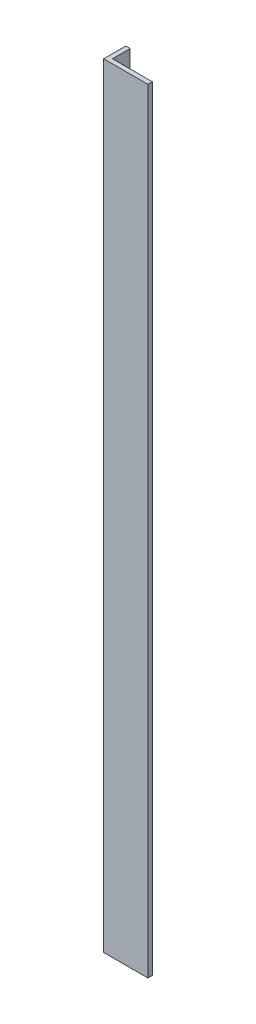
ISO-10303-21;
HEADER;
FILE_DESCRIPTION(('STEP AP214'),'2;1');
FILE_NAME('part.step','',(''),(''),'','','');
FILE_SCHEMA(('AUTOMOTIVE_DESIGN { 1 0 10303 214 1 1 1 1 }'));
ENDSEC;
DATA;
#1=APPLICATION_CONTEXT('core data for automotive mechanical design processes');
#2=APPLICATION_PROTOCOL_DEFINITION('international standard','automotive_design',2000,#1);
#3=PRODUCT_CONTEXT('',#1,'mechanical');
#4=PRODUCT('Part','Part','',(#3));
#5=PRODUCT_RELATED_PRODUCT_CATEGORY('part','',(#4));
#6=PRODUCT_DEFINITION_FORMATION('','',#4);
#7=PRODUCT_DEFINITION_CONTEXT('part definition',#1,'design');
#8=PRODUCT_DEFINITION('design','',#6,#7);
#9=PRODUCT_DEFINITION_SHAPE('','',#8);
#10=(LENGTH_UNIT() NAMED_UNIT(*) SI_UNIT(.MILLI.,.METRE.));
#11=(NAMED_UNIT(*) PLANE_ANGLE_UNIT() SI_UNIT($,.RADIAN.));
#12=(NAMED_UNIT(*) SI_UNIT($,.STERADIAN.) SOLID_ANGLE_UNIT());
#13=UNCERTAINTY_MEASURE_WITH_UNIT(LENGTH_MEASURE(1.E-05),#10,'distance_accuracy_value','');
#14=(GEOMETRIC_REPRESENTATION_CONTEXT(3) GLOBAL_UNCERTAINTY_ASSIGNED_CONTEXT((#13)) GLOBAL_UNIT_ASSIGNED_CONTEXT((#10,
#11,#12)) REPRESENTATION_CONTEXT('',''));
#15=CARTESIAN_POINT('',(0.,0.,0.));
#16=DIRECTION('',(0.,0.,1.));
#17=DIRECTION('',(1.,0.,0.));
#18=AXIS2_PLACEMENT_3D('',#15,#16,#17);
#19=CARTESIAN_POINT('',(20.,-72.3606797749978,0.));
#20=DIRECTION('',(0.,0.,1.));
#21=DIRECTION('',(1.,0.,0.));
#22=AXIS2_PLACEMENT_3D('',#19,#20,#21);
#23=PLANE('',#22);
#24=DIRECTION('',(-1.,0.,0.));
#25=VECTOR('',#24,1.);
#26=CARTESIAN_POINT('',(20.,-49.9999999999999,0.));
#27=LINE('',#26,#25);
#28=CARTESIAN_POINT('',(20.,-49.9999999999999,-3.25572901971327E-11));
#29=VERTEX_POINT('',#28);
#30=CARTESIAN_POINT('',(0.,-49.9999999999999,-3.25572901971327E-11));
#31=VERTEX_POINT('',#30);
#32=EDGE_CURVE('E38',#29,#31,#27,.T.);
#33=ORIENTED_EDGE('',*,*,#32,.F.);
#34=DIRECTION('',(0.,1.,0.));
#35=VECTOR('',#34,1.);
#36=CARTESIAN_POINT('',(20.,-72.3606797749978,0.));
#37=LINE('',#36,#35);
#38=CARTESIAN_POINT('',(20.,300.,0.));
#39=VERTEX_POINT('',#38);
#40=EDGE_CURVE('E81',#29,#39,#37,.T.);
#41=ORIENTED_EDGE('',*,*,#40,.T.);
#42=DIRECTION('',(1.,0.,0.));
#43=VECTOR('',#42,1.);
#44=CARTESIAN_POINT('',(20.,300.,0.));
#45=LINE('',#44,#43);
#46=CARTESIAN_POINT('',(0.,300.,0.));
#47=VERTEX_POINT('',#46);
#48=EDGE_CURVE('E85',#47,#39,#45,.T.);
#49=ORIENTED_EDGE('',*,*,#48,.F.);
#50=DIRECTION('',(0.,1.,0.));
#51=VECTOR('',#50,1.);
#52=CARTESIAN_POINT('',(0.,-72.3606797749978,0.));
#53=LINE('',#52,#51);
#54=EDGE_CURVE('E120',#31,#47,#53,.T.);
#55=ORIENTED_EDGE('',*,*,#54,.F.);
#56=EDGE_LOOP('',(#33,#41,#49,#55));
#57=FACE_BOUND('',#56,.T.);
#58=ADVANCED_FACE('F35',(#57),#23,.T.);
#59=CARTESIAN_POINT('',(0.,-72.3606797749978,0.));
#60=DIRECTION('',(-1.,0.,0.));
#61=DIRECTION('',(0.,0.,1.));
#62=AXIS2_PLACEMENT_3D('',#59,#60,#61);
#63=PLANE('',#62);
#64=CARTESIAN_POINT('',(0.,294.,-5.99999999999998));
#65=DIRECTION('',(1.,0.,0.));
#66=DIRECTION('',(0.,0.,-1.));
#67=AXIS2_PLACEMENT_3D('',#64,#65,#66);
#68=CIRCLE('',#67,1.5);
#69=CARTESIAN_POINT('',(0.,294.,-7.49999999999998));
#70=VERTEX_POINT('',#69);
#71=EDGE_CURVE('E197',#70,#70,#68,.T.);
#72=ORIENTED_EDGE('',*,*,#71,.T.);
#73=EDGE_LOOP('',(#72));
#74=FACE_BOUND('',#73,.T.);
#75=CARTESIAN_POINT('',(0.,280.,-5.99999999999998));
#76=DIRECTION('',(1.,0.,0.));
#77=DIRECTION('',(0.,0.,-1.));
#78=AXIS2_PLACEMENT_3D('',#75,#76,#77);
#79=CIRCLE('',#78,1.5);
#80=CARTESIAN_POINT('',(0.,280.,-7.49999999999998));
#81=VERTEX_POINT('',#80);
#82=EDGE_CURVE('E207',#81,#81,#79,.T.);
#83=ORIENTED_EDGE('',*,*,#82,.T.);
#84=EDGE_LOOP('',(#83));
#85=FACE_BOUND('',#84,.T.);
#86=CARTESIAN_POINT('',(0.,-43.9999999999999,-5.99999999999998));
#87=DIRECTION('',(1.,0.,0.));
#88=DIRECTION('',(0.,0.,-1.));
#89=AXIS2_PLACEMENT_3D('',#86,#87,#88);
#90=CIRCLE('',#89,1.49999999999999);
#91=CARTESIAN_POINT('',(0.,-43.9999999999999,-7.49999999999997));
#92=VERTEX_POINT('',#91);
#93=EDGE_CURVE('E213',#92,#92,#90,.T.);
#94=ORIENTED_EDGE('',*,*,#93,.T.);
#95=EDGE_LOOP('',(#94));
#96=FACE_BOUND('',#95,.T.);
#97=CARTESIAN_POINT('',(0.,-29.9999999999999,-5.99999999999998));
#98=DIRECTION('',(1.,0.,0.));
#99=DIRECTION('',(0.,0.,-1.));
#100=AXIS2_PLACEMENT_3D('',#97,#98,#99);
#101=CIRCLE('',#100,1.49999999999999);
#102=CARTESIAN_POINT('',(0.,-29.9999999999999,-7.49999999999997));
#103=VERTEX_POINT('',#102);
#104=EDGE_CURVE('E103',#103,#103,#101,.T.);
#105=ORIENTED_EDGE('',*,*,#104,.T.);
#106=EDGE_LOOP('',(#105));
#107=FACE_BOUND('',#106,.T.);
#108=DIRECTION('',(0.,0.,-1.));
#109=VECTOR('',#108,1.);
#110=CARTESIAN_POINT('',(0.,-49.9999999999999,0.));
#111=LINE('',#110,#109);
#112=CARTESIAN_POINT('',(0.,-49.9999999999999,-10.));
#113=VERTEX_POINT('',#112);
#114=EDGE_CURVE('E124',#31,#113,#111,.T.);
#115=ORIENTED_EDGE('',*,*,#114,.F.);
#116=ORIENTED_EDGE('',*,*,#54,.T.);
#117=DIRECTION('',(0.,0.,1.));
#118=VECTOR('',#117,1.);
#119=CARTESIAN_POINT('',(0.,300.,0.));
#120=LINE('',#119,#118);
#121=CARTESIAN_POINT('',(0.,300.,-10.));
#122=VERTEX_POINT('',#121);
#123=EDGE_CURVE('E88',#122,#47,#120,.T.);
#124=ORIENTED_EDGE('',*,*,#123,.F.);
#125=DIRECTION('',(0.,1.,0.));
#126=VECTOR('',#125,1.);
#127=CARTESIAN_POINT('',(0.,-72.3606797749978,-10.));
#128=LINE('',#127,#126);
#129=EDGE_CURVE('E126',#113,#122,#128,.T.);
#130=ORIENTED_EDGE('',*,*,#129,.F.);
#131=EDGE_LOOP('',(#115,#116,#124,#130));
#132=FACE_BOUND('',#131,.T.);
#133=ADVANCED_FACE('F138',(#74,#85,#96,#107,#132),#63,.T.);
#134=CARTESIAN_POINT('',(0.,-72.3606797749978,-10.));
#135=DIRECTION('',(0.,0.,-1.));
#136=DIRECTION('',(-1.,0.,0.));
#137=AXIS2_PLACEMENT_3D('',#134,#135,#136);
#138=PLANE('',#137);
#139=DIRECTION('',(1.,0.,0.));
#140=VECTOR('',#139,1.);
#141=CARTESIAN_POINT('',(0.,-49.9999999999999,-10.));
#142=LINE('',#141,#140);
#143=CARTESIAN_POINT('',(2.,-49.9999999999999,-10.));
#144=VERTEX_POINT('',#143);
#145=EDGE_CURVE('E122',#113,#144,#142,.T.);
#146=ORIENTED_EDGE('',*,*,#145,.F.);
#147=ORIENTED_EDGE('',*,*,#129,.T.);
#148=DIRECTION('',(-1.,0.,0.));
#149=VECTOR('',#148,1.);
#150=CARTESIAN_POINT('',(0.,300.,-10.));
#151=LINE('',#150,#149);
#152=CARTESIAN_POINT('',(2.,300.,-10.));
#153=VERTEX_POINT('',#152);
#154=EDGE_CURVE('E114',#153,#122,#151,.T.);
#155=ORIENTED_EDGE('',*,*,#154,.F.);
#156=DIRECTION('',(0.,1.,0.));
#157=VECTOR('',#156,1.);
#158=CARTESIAN_POINT('',(2.,-72.3606797749978,-10.));
#159=LINE('',#158,#157);
#160=EDGE_CURVE('E128',#144,#153,#159,.T.);
#161=ORIENTED_EDGE('',*,*,#160,.F.);
#162=EDGE_LOOP('',(#146,#147,#155,#161));
#163=FACE_BOUND('',#162,.T.);
#164=ADVANCED_FACE('F141',(#163),#138,.T.);
#165=CARTESIAN_POINT('',(2.,-72.3606797749978,-10.));
#166=DIRECTION('',(1.,0.,0.));
#167=DIRECTION('',(0.,0.,-1.));
#168=AXIS2_PLACEMENT_3D('',#165,#166,#167);
#169=PLANE('',#168);
#170=CARTESIAN_POINT('',(2.,294.,-5.99999999999998));
#171=DIRECTION('',(1.,0.,0.));
#172=DIRECTION('',(0.,0.,-1.));
#173=AXIS2_PLACEMENT_3D('',#170,#171,#172);
#174=CIRCLE('',#173,1.5);
#175=CARTESIAN_POINT('',(2.,294.,-7.49999999999998));
#176=VERTEX_POINT('',#175);
#177=EDGE_CURVE('E200',#176,#176,#174,.T.);
#178=ORIENTED_EDGE('',*,*,#177,.F.);
#179=EDGE_LOOP('',(#178));
#180=FACE_BOUND('',#179,.T.);
#181=CARTESIAN_POINT('',(2.,280.,-5.99999999999998));
#182=DIRECTION('',(1.,0.,0.));
#183=DIRECTION('',(0.,0.,-1.));
#184=AXIS2_PLACEMENT_3D('',#181,#182,#183);
#185=CIRCLE('',#184,1.5);
#186=CARTESIAN_POINT('',(2.,280.,-7.49999999999998));
#187=VERTEX_POINT('',#186);
#188=EDGE_CURVE('E202',#187,#187,#185,.T.);
#189=ORIENTED_EDGE('',*,*,#188,.F.);
#190=EDGE_LOOP('',(#189));
#191=FACE_BOUND('',#190,.T.);
#192=CARTESIAN_POINT('',(2.,-43.9999999999999,-5.99999999999998));
#193=DIRECTION('',(1.,0.,0.));
#194=DIRECTION('',(0.,0.,-1.));
#195=AXIS2_PLACEMENT_3D('',#192,#193,#194);
#196=CIRCLE('',#195,1.49999999999999);
#197=CARTESIAN_POINT('',(2.,-43.9999999999999,-7.49999999999997));
#198=VERTEX_POINT('',#197);
#199=EDGE_CURVE('E210',#198,#198,#196,.T.);
#200=ORIENTED_EDGE('',*,*,#199,.F.);
#201=EDGE_LOOP('',(#200));
#202=FACE_BOUND('',#201,.T.);
#203=CARTESIAN_POINT('',(2.,-29.9999999999999,-5.99999999999998));
#204=DIRECTION('',(1.,0.,0.));
#205=DIRECTION('',(0.,0.,-1.));
#206=AXIS2_PLACEMENT_3D('',#203,#204,#205);
#207=CIRCLE('',#206,1.49999999999999);
#208=CARTESIAN_POINT('',(2.,-29.9999999999999,-7.49999999999997));
#209=VERTEX_POINT('',#208);
#210=EDGE_CURVE('E106',#209,#209,#207,.T.);
#211=ORIENTED_EDGE('',*,*,#210,.F.);
#212=EDGE_LOOP('',(#211));
#213=FACE_BOUND('',#212,.T.);
#214=DIRECTION('',(0.,0.,1.));
#215=VECTOR('',#214,1.);
#216=CARTESIAN_POINT('',(2.,-49.9999999999999,-10.));
#217=LINE('',#216,#215);
#218=CARTESIAN_POINT('',(2.,-49.9999999999999,-2.));
#219=VERTEX_POINT('',#218);
#220=EDGE_CURVE('E119',#144,#219,#217,.T.);
#221=ORIENTED_EDGE('',*,*,#220,.F.);
#222=ORIENTED_EDGE('',*,*,#160,.T.);
#223=DIRECTION('',(0.,0.,-1.));
#224=VECTOR('',#223,1.);
#225=CARTESIAN_POINT('',(2.,300.,-10.));
#226=LINE('',#225,#224);
#227=CARTESIAN_POINT('',(2.,300.,-2.));
#228=VERTEX_POINT('',#227);
#229=EDGE_CURVE('E111',#228,#153,#226,.T.);
#230=ORIENTED_EDGE('',*,*,#229,.F.);
#231=DIRECTION('',(0.,1.,0.));
#232=VECTOR('',#231,1.);
#233=CARTESIAN_POINT('',(2.,-72.3606797749978,-2.));
#234=LINE('',#233,#232);
#235=EDGE_CURVE('E130',#219,#228,#234,.T.);
#236=ORIENTED_EDGE('',*,*,#235,.F.);
#237=EDGE_LOOP('',(#221,#222,#230,#236));
#238=FACE_BOUND('',#237,.T.);
#239=ADVANCED_FACE('F147',(#180,#191,#202,#213,#238),#169,.T.);
#240=CARTESIAN_POINT('',(2.,-72.3606797749978,-2.));
#241=DIRECTION('',(0.,0.,-1.));
#242=DIRECTION('',(-1.,0.,0.));
#243=AXIS2_PLACEMENT_3D('',#240,#241,#242);
#244=PLANE('',#243);
#245=DIRECTION('',(1.,0.,0.));
#246=VECTOR('',#245,1.);
#247=CARTESIAN_POINT('',(2.00000000000001,-49.9999999999999,-2.));
#248=LINE('',#247,#246);
#249=CARTESIAN_POINT('',(20.,-49.9999999999999,-2.));
#250=VERTEX_POINT('',#249);
#251=EDGE_CURVE('E117',#219,#250,#248,.T.);
#252=ORIENTED_EDGE('',*,*,#251,.F.);
#253=ORIENTED_EDGE('',*,*,#235,.T.);
#254=DIRECTION('',(-1.,0.,0.));
#255=VECTOR('',#254,1.);
#256=CARTESIAN_POINT('',(2.,300.,-2.));
#257=LINE('',#256,#255);
#258=CARTESIAN_POINT('',(20.,300.,-2.));
#259=VERTEX_POINT('',#258);
#260=EDGE_CURVE('E97',#259,#228,#257,.T.);
#261=ORIENTED_EDGE('',*,*,#260,.F.);
#262=DIRECTION('',(0.,1.,0.));
#263=VECTOR('',#262,1.);
#264=CARTESIAN_POINT('',(20.,-72.3606797749978,-2.));
#265=LINE('',#264,#263);
#266=EDGE_CURVE('E87',#250,#259,#265,.T.);
#267=ORIENTED_EDGE('',*,*,#266,.F.);
#268=EDGE_LOOP('',(#252,#253,#261,#267));
#269=FACE_BOUND('',#268,.T.);
#270=ADVANCED_FACE('F150',(#269),#244,.T.);
#271=CARTESIAN_POINT('',(20.,-72.3606797749978,-2.));
#272=DIRECTION('',(1.,0.,0.));
#273=DIRECTION('',(0.,0.,-1.));
#274=AXIS2_PLACEMENT_3D('',#271,#272,#273);
#275=PLANE('',#274);
#276=DIRECTION('',(0.,0.,1.));
#277=VECTOR('',#276,1.);
#278=CARTESIAN_POINT('',(20.,-49.9999999999999,-2.));
#279=LINE('',#278,#277);
#280=EDGE_CURVE('E11',#250,#29,#279,.T.);
#281=ORIENTED_EDGE('',*,*,#280,.F.);
#282=ORIENTED_EDGE('',*,*,#266,.T.);
#283=DIRECTION('',(0.,0.,-1.));
#284=VECTOR('',#283,1.);
#285=CARTESIAN_POINT('',(20.,300.,-2.));
#286=LINE('',#285,#284);
#287=EDGE_CURVE('E91',#39,#259,#286,.T.);
#288=ORIENTED_EDGE('',*,*,#287,.F.);
#289=ORIENTED_EDGE('',*,*,#40,.F.);
#290=EDGE_LOOP('',(#281,#282,#288,#289));
#291=FACE_BOUND('',#290,.T.);
#292=ADVANCED_FACE('F92',(#291),#275,.T.);
#293=CARTESIAN_POINT('',(28.,-49.9999999999999,-3.25572901971327E-11));
#294=DIRECTION('',(0.,1.,0.));
#295=DIRECTION('',(1.,0.,0.));
#296=AXIS2_PLACEMENT_3D('',#293,#294,#295);
#297=PLANE('',#296);
#298=ORIENTED_EDGE('',*,*,#145,.T.);
#299=ORIENTED_EDGE('',*,*,#220,.T.);
#300=ORIENTED_EDGE('',*,*,#251,.T.);
#301=ORIENTED_EDGE('',*,*,#280,.T.);
#302=ORIENTED_EDGE('',*,*,#32,.T.);
#303=ORIENTED_EDGE('',*,*,#114,.T.);
#304=EDGE_LOOP('',(#298,#299,#300,#301,#302,#303));
#305=FACE_BOUND('',#304,.T.);
#306=ADVANCED_FACE('F135',(#305),#297,.F.);
#307=CARTESIAN_POINT('',(0.,300.,0.));
#308=DIRECTION('',(0.,-1.,0.));
#309=DIRECTION('',(0.,0.,-1.));
#310=AXIS2_PLACEMENT_3D('',#307,#308,#309);
#311=PLANE('',#310);
#312=ORIENTED_EDGE('',*,*,#48,.T.);
#313=ORIENTED_EDGE('',*,*,#287,.T.);
#314=ORIENTED_EDGE('',*,*,#260,.T.);
#315=ORIENTED_EDGE('',*,*,#229,.T.);
#316=ORIENTED_EDGE('',*,*,#154,.T.);
#317=ORIENTED_EDGE('',*,*,#123,.T.);
#318=EDGE_LOOP('',(#312,#313,#314,#315,#316,#317));
#319=FACE_BOUND('',#318,.T.);
#320=ADVANCED_FACE('F100',(#319),#311,.F.);
#321=CARTESIAN_POINT('',(2.,-29.9999999999999,-5.99999999999998));
#322=DIRECTION('',(1.,0.,0.));
#323=DIRECTION('',(0.,0.,-1.));
#324=AXIS2_PLACEMENT_3D('',#321,#322,#323);
#325=CYLINDRICAL_SURFACE('',#324,1.49999999999999);
#326=ORIENTED_EDGE('',*,*,#104,.F.);
#327=EDGE_LOOP('',(#326));
#328=FACE_BOUND('',#327,.T.);
#329=ORIENTED_EDGE('',*,*,#210,.T.);
#330=EDGE_LOOP('',(#329));
#331=FACE_BOUND('',#330,.T.);
#332=ADVANCED_FACE('F178',(#328,#331),#325,.F.);
#333=CARTESIAN_POINT('',(2.,-43.9999999999999,-5.99999999999998));
#334=DIRECTION('',(1.,0.,0.));
#335=DIRECTION('',(0.,0.,-1.));
#336=AXIS2_PLACEMENT_3D('',#333,#334,#335);
#337=CYLINDRICAL_SURFACE('',#336,1.49999999999999);
#338=ORIENTED_EDGE('',*,*,#93,.F.);
#339=EDGE_LOOP('',(#338));
#340=FACE_BOUND('',#339,.T.);
#341=ORIENTED_EDGE('',*,*,#199,.T.);
#342=EDGE_LOOP('',(#341));
#343=FACE_BOUND('',#342,.T.);
#344=ADVANCED_FACE('F181',(#340,#343),#337,.F.);
#345=CARTESIAN_POINT('',(2.,280.,-5.99999999999998));
#346=DIRECTION('',(1.,0.,0.));
#347=DIRECTION('',(0.,0.,-1.));
#348=AXIS2_PLACEMENT_3D('',#345,#346,#347);
#349=CYLINDRICAL_SURFACE('',#348,1.5);
#350=ORIENTED_EDGE('',*,*,#82,.F.);
#351=EDGE_LOOP('',(#350));
#352=FACE_BOUND('',#351,.T.);
#353=ORIENTED_EDGE('',*,*,#188,.T.);
#354=EDGE_LOOP('',(#353));
#355=FACE_BOUND('',#354,.T.);
#356=ADVANCED_FACE('F185',(#352,#355),#349,.F.);
#357=CARTESIAN_POINT('',(2.,294.,-5.99999999999998));
#358=DIRECTION('',(1.,0.,0.));
#359=DIRECTION('',(0.,0.,-1.));
#360=AXIS2_PLACEMENT_3D('',#357,#358,#359);
#361=CYLINDRICAL_SURFACE('',#360,1.5);
#362=ORIENTED_EDGE('',*,*,#71,.F.);
#363=EDGE_LOOP('',(#362));
#364=FACE_BOUND('',#363,.T.);
#365=ORIENTED_EDGE('',*,*,#177,.T.);
#366=EDGE_LOOP('',(#365));
#367=FACE_BOUND('',#366,.T.);
#368=ADVANCED_FACE('F189',(#364,#367),#361,.F.);
#369=CLOSED_SHELL('',(#58,#133,#164,#239,#270,#292,#306,#320,#332,#344,#356,#368));
#370=MANIFOLD_SOLID_BREP('B2',#369);
#371=ADVANCED_BREP_SHAPE_REPRESENTATION('',(#18,#370),#14);
#372=SHAPE_DEFINITION_REPRESENTATION(#9,#371);
ENDSEC;
END-ISO-10303-21;
